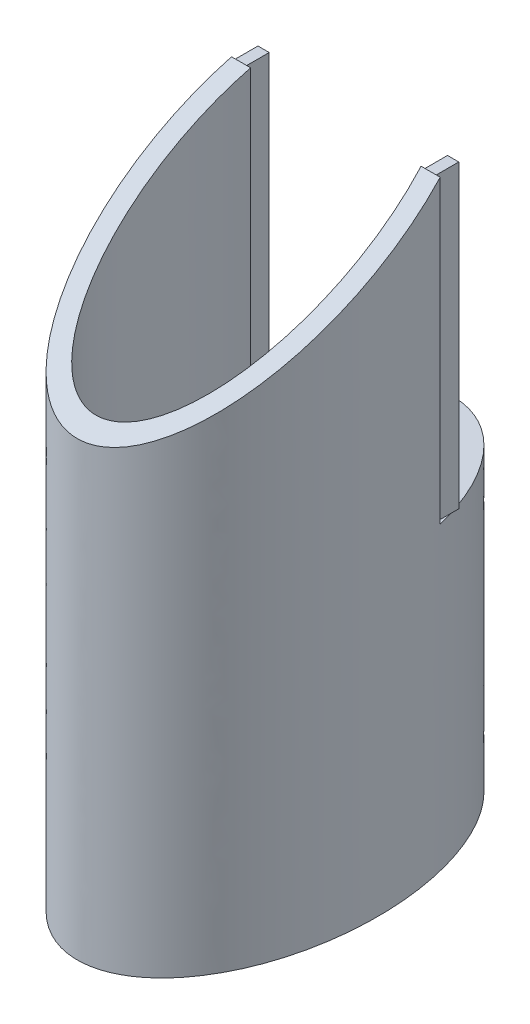
ISO-10303-21;
HEADER;
FILE_DESCRIPTION(('STEP AP214'),'2;1');
FILE_NAME('part.step','',(''),(''),'','','');
FILE_SCHEMA(('AUTOMOTIVE_DESIGN { 1 0 10303 214 1 1 1 1 }'));
ENDSEC;
DATA;
#1=APPLICATION_CONTEXT('core data for automotive mechanical design processes');
#2=APPLICATION_PROTOCOL_DEFINITION('international standard','automotive_design',2000,#1);
#3=PRODUCT_CONTEXT('',#1,'mechanical');
#4=PRODUCT('Part','Part','',(#3));
#5=PRODUCT_RELATED_PRODUCT_CATEGORY('part','',(#4));
#6=PRODUCT_DEFINITION_FORMATION('','',#4);
#7=PRODUCT_DEFINITION_CONTEXT('part definition',#1,'design');
#8=PRODUCT_DEFINITION('design','',#6,#7);
#9=PRODUCT_DEFINITION_SHAPE('','',#8);
#10=(LENGTH_UNIT() NAMED_UNIT(*) SI_UNIT(.MILLI.,.METRE.));
#11=(NAMED_UNIT(*) PLANE_ANGLE_UNIT() SI_UNIT($,.RADIAN.));
#12=(NAMED_UNIT(*) SI_UNIT($,.STERADIAN.) SOLID_ANGLE_UNIT());
#13=UNCERTAINTY_MEASURE_WITH_UNIT(LENGTH_MEASURE(1.E-05),#10,'distance_accuracy_value','');
#14=(GEOMETRIC_REPRESENTATION_CONTEXT(3) GLOBAL_UNCERTAINTY_ASSIGNED_CONTEXT((#13)) GLOBAL_UNIT_ASSIGNED_CONTEXT((#10,
#11,#12)) REPRESENTATION_CONTEXT('',''));
#15=CARTESIAN_POINT('',(0.,0.,0.));
#16=DIRECTION('',(0.,0.,1.));
#17=DIRECTION('',(1.,0.,0.));
#18=AXIS2_PLACEMENT_3D('',#15,#16,#17);
#19=CARTESIAN_POINT('',(-15.,40.,-25.));
#20=DIRECTION('',(0.,-1.,0.));
#21=DIRECTION('',(0.,0.,-1.));
#22=AXIS2_PLACEMENT_3D('',#19,#20,#21);
#23=PLANE('',#22);
#24=DIRECTION('',(1.,0.,0.));
#25=VECTOR('',#24,1.);
#26=CARTESIAN_POINT('',(-15.,40.,-9.43240385873634));
#27=LINE('',#26,#25);
#28=CARTESIAN_POINT('',(-13.891389875763,40.,-9.43240385873634));
#29=VERTEX_POINT('',#28);
#30=CARTESIAN_POINT('',(-13.3699801041899,40.,-9.43240385873634));
#31=VERTEX_POINT('',#30);
#32=EDGE_CURVE('E217',#29,#31,#27,.T.);
#33=ORIENTED_EDGE('',*,*,#32,.T.);
#34=DIRECTION('',(0.,0.,1.));
#35=VECTOR('',#34,1.);
#36=CARTESIAN_POINT('',(-13.3699801041899,40.,-12.4324038587363));
#37=LINE('',#36,#35);
#38=CARTESIAN_POINT('',(-13.3699801041899,40.,-11.3337784242951));
#39=VERTEX_POINT('',#38);
#40=EDGE_CURVE('E166',#39,#31,#37,.T.);
#41=ORIENTED_EDGE('',*,*,#40,.F.);
#42=CARTESIAN_POINT('',(0.,40.,0.));
#43=DIRECTION('',(0.,1.,0.));
#44=DIRECTION('',(0.,0.,-1.));
#45=AXIS2_PLACEMENT_3D('',#42,#43,#44);
#46=ELLIPSE('',#45,25.,15.);
#47=EDGE_CURVE('E230',#29,#39,#46,.F.);
#48=ORIENTED_EDGE('',*,*,#47,.F.);
#49=EDGE_LOOP('',(#33,#41,#48));
#50=FACE_BOUND('',#49,.T.);
#51=ADVANCED_FACE('F33',(#50),#23,.F.);
#52=CARTESIAN_POINT('',(-15.,80.,-9.43240385873634));
#53=DIRECTION('',(0.,0.,1.));
#54=DIRECTION('',(0.,-1.,0.));
#55=AXIS2_PLACEMENT_3D('',#52,#53,#54);
#56=PLANE('',#55);
#57=DIRECTION('',(1.,0.,0.));
#58=VECTOR('',#57,1.);
#59=CARTESIAN_POINT('',(-15.,80.,-9.43240385873634));
#60=LINE('',#59,#58);
#61=CARTESIAN_POINT('',(-13.891389875763,80.,-9.43240385873634));
#62=VERTEX_POINT('',#61);
#63=CARTESIAN_POINT('',(-13.3699801041899,80.,-9.43240385873634));
#64=VERTEX_POINT('',#63);
#65=EDGE_CURVE('E239',#62,#64,#60,.T.);
#66=ORIENTED_EDGE('',*,*,#65,.T.);
#67=DIRECTION('',(0.,-1.,0.));
#68=VECTOR('',#67,1.);
#69=CARTESIAN_POINT('',(-13.3699801041899,80.,-9.43240385873634));
#70=LINE('',#69,#68);
#71=EDGE_CURVE('E144',#64,#31,#70,.T.);
#72=ORIENTED_EDGE('',*,*,#71,.T.);
#73=ORIENTED_EDGE('',*,*,#32,.F.);
#74=DIRECTION('',(0.,-1.,0.));
#75=VECTOR('',#74,1.);
#76=CARTESIAN_POINT('',(-13.891389875763,80.,-9.43240385873634));
#77=LINE('',#76,#75);
#78=EDGE_CURVE('E223',#62,#29,#77,.T.);
#79=ORIENTED_EDGE('',*,*,#78,.F.);
#80=EDGE_LOOP('',(#66,#72,#73,#79));
#81=FACE_BOUND('',#80,.T.);
#82=ADVANCED_FACE('F285',(#81),#56,.F.);
#83=DIRECTION('',(0.,0.,1.));
#84=VECTOR('',#83,1.);
#85=CARTESIAN_POINT('',(13.3699801041899,40.,-12.4324038587363));
#86=LINE('',#85,#84);
#87=CARTESIAN_POINT('',(13.3699801041899,40.,-11.3337784242951));
#88=VERTEX_POINT('',#87);
#89=CARTESIAN_POINT('',(13.3699801041899,40.,-9.43240385873634));
#90=VERTEX_POINT('',#89);
#91=EDGE_CURVE('E206',#88,#90,#86,.T.);
#92=ORIENTED_EDGE('',*,*,#91,.T.);
#93=CARTESIAN_POINT('',(13.891389875763,40.,-9.43240385873634));
#94=VERTEX_POINT('',#93);
#95=EDGE_CURVE('E213',#90,#94,#27,.T.);
#96=ORIENTED_EDGE('',*,*,#95,.T.);
#97=EDGE_CURVE('E229',#88,#94,#46,.F.);
#98=ORIENTED_EDGE('',*,*,#97,.F.);
#99=EDGE_LOOP('',(#92,#96,#98));
#100=FACE_BOUND('',#99,.T.);
#101=ADVANCED_FACE('F288',(#100),#23,.F.);
#102=DIRECTION('',(1.,0.,0.));
#103=VECTOR('',#102,1.);
#104=CARTESIAN_POINT('',(-13.3699801041899,40.,-12.4324038587363));
#105=LINE('',#104,#103);
#106=CARTESIAN_POINT('',(-13.0137127809699,40.,-12.4324038587363));
#107=VERTEX_POINT('',#106);
#108=CARTESIAN_POINT('',(-11.8699801041899,40.,-12.4324038587363));
#109=VERTEX_POINT('',#108);
#110=EDGE_CURVE('E162',#107,#109,#105,.T.);
#111=ORIENTED_EDGE('',*,*,#110,.T.);
#112=DIRECTION('',(0.,0.,1.));
#113=VECTOR('',#112,1.);
#114=CARTESIAN_POINT('',(-11.8699801041899,40.,-12.4324038587363));
#115=LINE('',#114,#113);
#116=CARTESIAN_POINT('',(-11.8699801041899,40.,-9.43240385873634));
#117=VERTEX_POINT('',#116);
#118=EDGE_CURVE('E173',#109,#117,#115,.T.);
#119=ORIENTED_EDGE('',*,*,#118,.T.);
#120=CARTESIAN_POINT('',(-11.3485703326168,40.,-9.43240385873634));
#121=VERTEX_POINT('',#120);
#122=EDGE_CURVE('E216',#117,#121,#27,.T.);
#123=ORIENTED_EDGE('',*,*,#122,.T.);
#124=CARTESIAN_POINT('',(0.,40.,0.));
#125=DIRECTION('',(0.,1.,0.));
#126=DIRECTION('',(0.,0.,-1.));
#127=AXIS2_PLACEMENT_3D('',#124,#125,#126);
#128=ELLIPSE('',#127,22.5,12.5);
#129=CARTESIAN_POINT('',(11.3485703326168,40.,-9.43240385873634));
#130=VERTEX_POINT('',#129);
#131=EDGE_CURVE('E11',#121,#130,#128,.F.);
#132=ORIENTED_EDGE('',*,*,#131,.T.);
#133=CARTESIAN_POINT('',(11.8699801041899,40.,-9.43240385873634));
#134=VERTEX_POINT('',#133);
#135=EDGE_CURVE('E214',#130,#134,#27,.T.);
#136=ORIENTED_EDGE('',*,*,#135,.T.);
#137=DIRECTION('',(0.,0.,1.));
#138=VECTOR('',#137,1.);
#139=CARTESIAN_POINT('',(11.8699801041899,40.,-12.4324038587363));
#140=LINE('',#139,#138);
#141=CARTESIAN_POINT('',(11.8699801041899,40.,-12.4324038587363));
#142=VERTEX_POINT('',#141);
#143=EDGE_CURVE('E58',#142,#134,#140,.T.);
#144=ORIENTED_EDGE('',*,*,#143,.F.);
#145=DIRECTION('',(-1.,0.,0.));
#146=VECTOR('',#145,1.);
#147=CARTESIAN_POINT('',(13.3699801041899,40.,-12.4324038587363));
#148=LINE('',#147,#146);
#149=CARTESIAN_POINT('',(13.0137127809699,40.,-12.4324038587363));
#150=VERTEX_POINT('',#149);
#151=EDGE_CURVE('E183',#150,#142,#148,.T.);
#152=ORIENTED_EDGE('',*,*,#151,.F.);
#153=EDGE_CURVE('E234',#107,#150,#46,.F.);
#154=ORIENTED_EDGE('',*,*,#153,.F.);
#155=EDGE_LOOP('',(#111,#119,#123,#132,#136,#144,#152,#154));
#156=FACE_BOUND('',#155,.T.);
#157=ADVANCED_FACE('F287',(#156),#23,.F.);
#158=DIRECTION('',(0.,-1.,0.));
#159=VECTOR('',#158,1.);
#160=CARTESIAN_POINT('',(13.3699801041899,80.,-9.43240385873634));
#161=LINE('',#160,#159);
#162=CARTESIAN_POINT('',(13.3699801041899,80.,-9.43240385873634));
#163=VERTEX_POINT('',#162);
#164=EDGE_CURVE('E179',#163,#90,#161,.T.);
#165=ORIENTED_EDGE('',*,*,#164,.F.);
#166=CARTESIAN_POINT('',(13.891389875763,80.,-9.43240385873634));
#167=VERTEX_POINT('',#166);
#168=EDGE_CURVE('E233',#163,#167,#60,.T.);
#169=ORIENTED_EDGE('',*,*,#168,.T.);
#170=DIRECTION('',(0.,-1.,0.));
#171=VECTOR('',#170,1.);
#172=CARTESIAN_POINT('',(13.891389875763,80.,-9.43240385873634));
#173=LINE('',#172,#171);
#174=EDGE_CURVE('E226',#94,#167,#173,.F.);
#175=ORIENTED_EDGE('',*,*,#174,.F.);
#176=ORIENTED_EDGE('',*,*,#95,.F.);
#177=EDGE_LOOP('',(#165,#169,#175,#176));
#178=FACE_BOUND('',#177,.T.);
#179=ADVANCED_FACE('F259',(#178),#56,.F.);
#180=DIRECTION('',(0.,1.,0.));
#181=VECTOR('',#180,1.);
#182=CARTESIAN_POINT('',(11.8699801041899,80.,-9.43240385873634));
#183=LINE('',#182,#181);
#184=CARTESIAN_POINT('',(11.8699801041899,80.,-9.43240385873634));
#185=VERTEX_POINT('',#184);
#186=EDGE_CURVE('E195',#134,#185,#183,.T.);
#187=ORIENTED_EDGE('',*,*,#186,.F.);
#188=ORIENTED_EDGE('',*,*,#135,.F.);
#189=DIRECTION('',(0.,-1.,0.));
#190=VECTOR('',#189,1.);
#191=CARTESIAN_POINT('',(11.3485703326168,80.,-9.43240385873634));
#192=LINE('',#191,#190);
#193=CARTESIAN_POINT('',(11.3485703326168,80.,-9.43240385873634));
#194=VERTEX_POINT('',#193);
#195=EDGE_CURVE('E221',#130,#194,#192,.F.);
#196=ORIENTED_EDGE('',*,*,#195,.T.);
#197=EDGE_CURVE('E235',#194,#185,#60,.T.);
#198=ORIENTED_EDGE('',*,*,#197,.T.);
#199=EDGE_LOOP('',(#187,#188,#196,#198));
#200=FACE_BOUND('',#199,.T.);
#201=ADVANCED_FACE('F293',(#200),#56,.F.);
#202=CARTESIAN_POINT('',(0.,80.,0.));
#203=DIRECTION('',(0.,1.,0.));
#204=DIRECTION('',(0.,0.,-1.));
#205=AXIS2_PLACEMENT_3D('',#202,#203,#204);
#206=ELLIPSE('',#205,25.,15.);
#207=DIRECTION('',(0.,-1.,0.));
#208=VECTOR('',#207,1.);
#209=SURFACE_OF_LINEAR_EXTRUSION('',#206,#208);
#210=CARTESIAN_POINT('',(0.,0.,0.));
#211=DIRECTION('',(0.,1.,0.));
#212=DIRECTION('',(0.,0.,-1.));
#213=AXIS2_PLACEMENT_3D('',#210,#211,#212);
#214=ELLIPSE('',#213,25.,15.);
#215=CARTESIAN_POINT('',(0.,0.,-25.));
#216=VERTEX_POINT('',#215);
#217=EDGE_CURVE('E269',#216,#216,#214,.T.);
#218=ORIENTED_EDGE('',*,*,#217,.T.);
#219=EDGE_LOOP('',(#218));
#220=FACE_BOUND('',#219,.T.);
#221=ORIENTED_EDGE('',*,*,#47,.T.);
#222=CARTESIAN_POINT('',(0.,40.,0.));
#223=DIRECTION('',(0.,1.,0.));
#224=DIRECTION('',(0.,0.,-1.));
#225=AXIS2_PLACEMENT_3D('',#222,#223,#224);
#226=ELLIPSE('',#225,25.,15.);
#227=EDGE_CURVE('E146',#39,#107,#226,.F.);
#228=ORIENTED_EDGE('',*,*,#227,.T.);
#229=ORIENTED_EDGE('',*,*,#153,.T.);
#230=CARTESIAN_POINT('',(0.,40.,0.));
#231=DIRECTION('',(0.,1.,0.));
#232=DIRECTION('',(0.,0.,-1.));
#233=AXIS2_PLACEMENT_3D('',#230,#231,#232);
#234=ELLIPSE('',#233,25.,15.);
#235=EDGE_CURVE('E210',#88,#150,#234,.T.);
#236=ORIENTED_EDGE('',*,*,#235,.F.);
#237=ORIENTED_EDGE('',*,*,#97,.T.);
#238=ORIENTED_EDGE('',*,*,#174,.T.);
#239=CARTESIAN_POINT('',(13.891389875763,80.,-9.43240385873634));
#240=CARTESIAN_POINT('',(13.9691722572692,79.8163180522933,-9.11417694323094));
#241=CARTESIAN_POINT('',(14.0425702852247,79.6321815787162,-8.79516256674996));
#242=CARTESIAN_POINT('',(14.1808212896144,79.2631160717446,-8.15576071278812));
#243=CARTESIAN_POINT('',(14.2456746189232,79.0781870714053,-7.83537329257508));
#244=CARTESIAN_POINT('',(14.4277350836751,78.5224456343772,-6.87255748224663));
#245=CARTESIAN_POINT('',(14.5324771091048,78.1505969201434,-6.22833375289996));
#246=CARTESIAN_POINT('',(14.7100068827078,77.4050788497254,-4.93673205243561));
#247=CARTESIAN_POINT('',(14.7827994444004,77.0314097763805,-4.28935457133352));
#248=CARTESIAN_POINT('',(14.897342305784,76.2828640780965,-2.99250753952791));
#249=CARTESIAN_POINT('',(14.939090799703,75.9079873841861,-2.34303786933244));
#250=CARTESIAN_POINT('',(14.9920291863666,75.1577338025655,-1.0432319487899));
#251=CARTESIAN_POINT('',(15.0032219417139,74.7823569650078,-0.392895785331507));
#252=CARTESIAN_POINT('',(14.9951882731402,74.0316845895147,0.907635690900739));
#253=CARTESIAN_POINT('',(14.9759618966811,73.6563890514535,1.55783100389278));
#254=CARTESIAN_POINT('',(14.906863295051,72.9064858991288,2.85702980960819));
#255=CARTESIAN_POINT('',(14.8569898737968,72.5318783122868,3.50603325482415));
#256=CARTESIAN_POINT('',(14.7260016180444,71.7840159133354,4.80169647819505));
#257=CARTESIAN_POINT('',(14.6448860840158,71.4107611317051,5.44835620354538));
#258=CARTESIAN_POINT('',(14.4504025411897,70.6662705541821,6.7381777840864));
#259=CARTESIAN_POINT('',(14.3370280456588,70.2950351796744,7.38133890923238));
#260=CARTESIAN_POINT('',(14.0765971174623,69.5555340309266,8.66251636034721));
#261=CARTESIAN_POINT('',(13.9295424358526,69.1872681033329,9.30053295199929));
#262=CARTESIAN_POINT('',(13.5997172310253,68.4546007464991,10.5698709352232));
#263=CARTESIAN_POINT('',(13.4169348353862,68.0902006444374,11.2011900274732));
#264=CARTESIAN_POINT('',(13.0130237880806,67.3666394847937,12.4547516261371));
#265=CARTESIAN_POINT('',(12.7918865635688,67.0074796179765,13.076992069564));
#266=CARTESIAN_POINT('',(12.3075540063087,66.2957515890738,14.3100529018569));
#267=CARTESIAN_POINT('',(12.0443092062778,65.9431917315604,14.9208589031446));
#268=CARTESIAN_POINT('',(11.614830693757,65.4216374728512,15.8244458102408));
#269=CARTESIAN_POINT('',(11.4659481580687,65.2490465907758,16.12345757886));
#270=CARTESIAN_POINT('',(11.1559285715647,64.9066403431425,16.7166725648427));
#271=CARTESIAN_POINT('',(10.9947920731019,64.7368248529012,17.0108759982187));
#272=CARTESIAN_POINT('',(10.5818311684968,64.3224880173983,17.7287099214133));
#273=CARTESIAN_POINT('',(10.3225743020213,64.0797998934683,18.1491643758235));
#274=CARTESIAN_POINT('',(9.77298435631481,63.6027950517577,18.9755699173254));
#275=CARTESIAN_POINT('',(9.48260212264972,63.3684923786046,19.3814966722574));
#276=CARTESIAN_POINT('',(8.92940222405932,62.9570124976655,20.0943809536938));
#277=CARTESIAN_POINT('',(8.67269622367722,62.7777861422272,20.4048886055371));
#278=CARTESIAN_POINT('',(8.1355944711672,62.4282831862683,21.0103985591466));
#279=CARTESIAN_POINT('',(7.85519170594174,62.25800925959,21.305396228511));
#280=CARTESIAN_POINT('',(7.26934033201011,61.929013394506,21.8753778770445));
#281=CARTESIAN_POINT('',(6.96393244622412,61.7702734377836,22.1503930727451));
#282=CARTESIAN_POINT('',(6.32603523068147,61.4670558585028,22.6757141300739));
#283=CARTESIAN_POINT('',(5.99356446551816,61.3225686068766,22.9260366739543));
#284=CARTESIAN_POINT('',(5.43673907562542,61.1048929307523,23.3031573429064));
#285=CARTESIAN_POINT('',(5.22126293758054,61.026005042815,23.4398297245011));
#286=CARTESIAN_POINT('',(4.77982350476954,60.8758439566422,23.6999821231354));
#287=CARTESIAN_POINT('',(4.55385849471765,60.8045720102086,23.8234599714422));
#288=CARTESIAN_POINT('',(4.09183826666161,60.6708083476521,24.0552040174603));
#289=CARTESIAN_POINT('',(3.85578730496099,60.6083129745966,24.1634765507664));
#290=CARTESIAN_POINT('',(3.37425618582548,60.4932849981814,24.3627612305537));
#291=CARTESIAN_POINT('',(3.12878084331744,60.4407473867453,24.4537820534711));
#292=CARTESIAN_POINT('',(2.62625774946812,60.3462016255477,24.6175815249796));
#293=CARTESIAN_POINT('',(2.36910324262639,60.3043343005629,24.6901161962236));
#294=CARTESIAN_POINT('',(1.84789191895349,60.2331479588341,24.8134457353388));
#295=CARTESIAN_POINT('',(1.58383523677758,60.2038286974822,24.8642410269905));
#296=CARTESIAN_POINT('',(1.05141843206874,60.15866829689,24.9424809148122));
#297=CARTESIAN_POINT('',(0.783063372528554,60.1428123405568,24.9699511814297));
#298=CARTESIAN_POINT('',(0.244522295375012,60.1250589349879,25.0007087575793));
#299=CARTESIAN_POINT('',(-0.0256634395069784,60.1231593773726,25.0039997198556));
#300=CARTESIAN_POINT('',(-0.524337138653941,60.1326011338996,24.9876419825055));
#301=CARTESIAN_POINT('',(-0.752982398672291,60.1419932197958,24.9713702989665));
#302=CARTESIAN_POINT('',(-1.20774890172815,60.1706488979265,24.9217246578075));
#303=CARTESIAN_POINT('',(-1.43387049206654,60.1899111143078,24.8883530838377));
#304=CARTESIAN_POINT('',(-1.88215691709891,60.2378712363048,24.8052627100642));
#305=CARTESIAN_POINT('',(-2.10431994356141,60.266573343098,24.7555366317678));
#306=CARTESIAN_POINT('',(-2.54332095944435,60.3327977460061,24.640803596041));
#307=CARTESIAN_POINT('',(-2.7601581183926,60.3703214081589,24.5757942719651));
#308=CARTESIAN_POINT('',(-3.24633323336243,60.4649261367014,24.4118926401925));
#309=CARTESIAN_POINT('',(-3.51369820683925,60.524547560558,24.3085991916592));
#310=CARTESIAN_POINT('',(-4.0367798565143,60.6554037393262,24.0818923287142));
#311=CARTESIAN_POINT('',(-4.29249343938487,60.7266415555527,23.9584736106086));
#312=CARTESIAN_POINT('',(-4.79196631408531,60.8793031834411,23.6939890514809));
#313=CARTESIAN_POINT('',(-5.03570527426264,60.9607435387534,23.5528945487696));
#314=CARTESIAN_POINT('',(-5.51058211201528,61.1322890441762,23.2556938834834));
#315=CARTESIAN_POINT('',(-5.74171948971172,61.2223945376235,23.0995871260812));
#316=CARTESIAN_POINT('',(-6.31472489097134,61.4613814809127,22.6855449256446));
#317=CARTESIAN_POINT('',(-6.64796941198343,61.615443263282,22.4186346145729));
#318=CARTESIAN_POINT('',(-7.28631805076753,61.9375177114868,21.8606442432003));
#319=CARTESIAN_POINT('',(-7.59140498157578,62.105538780526,21.5695496244433));
#320=CARTESIAN_POINT('',(-8.17572907478409,62.4527943071829,20.967933316908));
#321=CARTESIAN_POINT('',(-8.45492991565614,62.6320439466171,20.6573853258028));
#322=CARTESIAN_POINT('',(-8.98902432228292,62.9992640718325,20.0211805750487));
#323=CARTESIAN_POINT('',(-9.24392310027856,63.1872326746795,19.6955270775621));
#324=CARTESIAN_POINT('',(-9.70440327487929,63.548985257037,19.0687947835233));
#325=CARTESIAN_POINT('',(-9.91231926545113,63.7220314670505,18.7689941643551));
#326=CARTESIAN_POINT('',(-10.3117731887537,64.0727669679304,18.1613488404856));
#327=CARTESIAN_POINT('',(-10.5033115210897,64.2504561453728,17.85350433229));
#328=CARTESIAN_POINT('',(-10.87087130989,64.6094889131023,17.2314840866079));
#329=CARTESIAN_POINT('',(-11.0469131209659,64.7908273133082,16.9173173408787));
#330=CARTESIAN_POINT('',(-11.3847353976437,65.1567851534985,16.2832994847817));
#331=CARTESIAN_POINT('',(-11.5465158401583,65.3414045987937,15.9634483652127));
#332=CARTESIAN_POINT('',(-11.8563587327144,65.7130627760524,15.3195547390398));
#333=CARTESIAN_POINT('',(-12.0044477719246,65.9000959791563,14.9955218111232));
#334=CARTESIAN_POINT('',(-12.2880082444287,66.2765433724061,14.3433309219281));
#335=CARTESIAN_POINT('',(-12.4234786541959,66.4659577542832,14.0151726284776));
#336=CARTESIAN_POINT('',(-12.81198408179,67.0373092640561,13.0253125420924));
#337=CARTESIAN_POINT('',(-13.0470860027999,67.4223215999485,12.3582829857739));
#338=CARTESIAN_POINT('',(-13.4733640583201,68.1978761152158,11.0146434812874));
#339=CARTESIAN_POINT('',(-13.6645844955263,68.5884122909269,10.3380439343997));
#340=CARTESIAN_POINT('',(-14.0065234937142,69.3738362952411,8.97730565076679));
#341=CARTESIAN_POINT('',(-14.1572456822324,69.7687237307895,8.29316759498449));
#342=CARTESIAN_POINT('',(-14.4204535100895,70.5615042994578,6.91968414606824));
#343=CARTESIAN_POINT('',(-14.5329528029914,70.9593963072905,6.23034070248155));
#344=CARTESIAN_POINT('',(-14.7214123472149,71.7573289852471,4.84793128197337));
#345=CARTESIAN_POINT('',(-14.7973723275524,72.1573696712838,4.15486527748304));
#346=CARTESIAN_POINT('',(-14.9137949441453,72.9586668560043,2.76662688671917));
#347=CARTESIAN_POINT('',(-14.9542634126202,73.3599231440532,2.07145486536844));
#348=CARTESIAN_POINT('',(-15.0002712042096,74.1629386478452,0.680239506074035));
#349=CARTESIAN_POINT('',(-15.0058100548669,74.5646978703174,-0.0158038435278424));
#350=CARTESIAN_POINT('',(-14.981470349293,75.3869899754858,-1.44041569863495));
#351=CARTESIAN_POINT('',(-14.9499012452888,75.8075104393267,-2.16896268861257));
#352=CARTESIAN_POINT('',(-14.8480661224218,76.6473795733095,-3.62402654911915));
#353=CARTESIAN_POINT('',(-14.7778022761963,77.0667283079133,-4.35054353132754));
#354=CARTESIAN_POINT('',(-14.6421773430681,77.6960234397999,-5.4407902935328));
#355=CARTESIAN_POINT('',(-14.5916319421316,77.9067898158691,-5.80594067758602));
#356=CARTESIAN_POINT('',(-14.4802085141043,78.3276396779509,-6.53505834632386));
#357=CARTESIAN_POINT('',(-14.4193306983084,78.5377231778386,-6.89902565504697));
#358=CARTESIAN_POINT('',(-14.2869890855478,78.9570991899227,-7.62558989518421));
#359=CARTESIAN_POINT('',(-14.2155231788966,79.1663915359386,-7.98818653869249));
#360=CARTESIAN_POINT('',(-14.0617012227855,79.5839847535098,-8.7116621073195));
#361=CARTESIAN_POINT('',(-13.9793445778921,79.7922855702092,-9.07254093740111));
#362=CARTESIAN_POINT('',(-13.891389875763,80.,-9.43240385873632));
#363=B_SPLINE_CURVE_WITH_KNOTS('',3,(#239,#240,#241,#242,#243,#244,#245,#246,#247,#248,#249,
#250,#251,#252,#253,#254,#255,#256,#257,#258,#259,#260,#261,#262,#263,#264,#265,#266,#267,#268,
#269,#270,#271,#272,#273,#274,#275,#276,#277,#278,#279,#280,#281,#282,#283,#284,#285,#286,#287,
#288,#289,#290,#291,#292,#293,#294,#295,#296,#297,#298,#299,#300,#301,#302,#303,#304,#305,#306,
#307,#308,#309,#310,#311,#312,#313,#314,#315,#316,#317,#318,#319,#320,#321,#322,#323,#324,#325,
#326,#327,#328,#329,#330,#331,#332,#333,#334,#335,#336,#337,#338,#339,#340,#341,#342,#343,#344,
#345,#346,#347,#348,#349,#350,#351,#352,#353,#354,#355,#356,#357,#358,#359,#360,#361,#362),
.UNSPECIFIED.,.F.,.F.,(4,2,2,2,2,2,2,2,2,2,2,2,2,2,2,2,2,2,2,2,2,2,2,2,2,2,2,2,2,2,2,2,2,2,2,2,
2,2,2,2,2,2,2,2,2,2,2,2,2,2,2,2,2,2,2,2,2,2,2,2,2,4),(0.,1.12666871968438,2.25329089619278,
4.5060338442698,6.75843727658321,9.01097171649737,11.2632951213344,13.5156150119601,
15.7680228110015,18.020481045786,20.2733925324321,22.5261869152543,24.7797311846935,
27.0337798037118,29.2904961572355,30.4182366344189,31.5459263082848,33.195993778566,
34.8487066045398,36.1707036293423,37.4930932808044,38.8133705883389,40.1327497236204,
40.9334548502215,41.7342913837468,42.5347932365432,43.334891416847,44.1450581899113,
44.9552091691255,45.7644673735701,46.5736033216448,47.2609960830119,47.9482930508758,
48.635896311757,49.3236061197817,50.2005636974434,51.0777527579054,51.9563830719822,
52.8350482141961,54.1945581260053,55.5548924485419,56.9171074897769,58.2790297064343,
59.4899615942072,60.7008639275078,61.910151243705,63.1194405175412,64.3263296846546,
65.5333166603069,67.9475053754584,70.3592458988179,72.7707703240566,75.1814324231312,
77.5921123999619,80.0023961623132,82.4127125260394,84.9372321647561,87.4616100708632,
88.7354003069261,90.0091644974678,91.2831828288322,92.5572708439221),.UNSPECIFIED.);
#364=EDGE_CURVE('E240',#167,#62,#363,.T.);
#365=ORIENTED_EDGE('',*,*,#364,.T.);
#366=ORIENTED_EDGE('',*,*,#78,.T.);
#367=EDGE_LOOP('',(#221,#228,#229,#236,#237,#238,#365,#366));
#368=FACE_BOUND('',#367,.T.);
#369=ADVANCED_FACE('F35',(#220,#368),#209,.F.);
#370=CARTESIAN_POINT('',(0.,0.,0.));
#371=DIRECTION('',(0.,1.,0.));
#372=DIRECTION('',(0.,0.,1.));
#373=AXIS2_PLACEMENT_3D('',#370,#371,#372);
#374=PLANE('',#373);
#375=ORIENTED_EDGE('',*,*,#217,.F.);
#376=EDGE_LOOP('',(#375));
#377=FACE_BOUND('',#376,.T.);
#378=CARTESIAN_POINT('',(0.,0.,0.));
#379=DIRECTION('',(0.,1.,0.));
#380=DIRECTION('',(0.,0.,-1.));
#381=AXIS2_PLACEMENT_3D('',#378,#379,#380);
#382=ELLIPSE('',#381,22.5,12.5);
#383=CARTESIAN_POINT('',(0.,0.,-22.5));
#384=VERTEX_POINT('',#383);
#385=EDGE_CURVE('E248',#384,#384,#382,.T.);
#386=ORIENTED_EDGE('',*,*,#385,.T.);
#387=EDGE_LOOP('',(#386));
#388=FACE_BOUND('',#387,.T.);
#389=ADVANCED_FACE('F275',(#377,#388),#374,.F.);
#390=CARTESIAN_POINT('',(0.,80.,0.));
#391=DIRECTION('',(0.,1.,0.));
#392=DIRECTION('',(0.,0.,-1.));
#393=AXIS2_PLACEMENT_3D('',#390,#391,#392);
#394=ELLIPSE('',#393,22.5,12.5);
#395=DIRECTION('',(0.,-1.,0.));
#396=VECTOR('',#395,1.);
#397=SURFACE_OF_LINEAR_EXTRUSION('',#394,#396);
#398=ORIENTED_EDGE('',*,*,#195,.F.);
#399=ORIENTED_EDGE('',*,*,#131,.F.);
#400=DIRECTION('',(0.,-1.,0.));
#401=VECTOR('',#400,1.);
#402=CARTESIAN_POINT('',(-11.3485703326168,80.,-9.43240385873634));
#403=LINE('',#402,#401);
#404=CARTESIAN_POINT('',(-11.3485703326168,80.,-9.43240385873634));
#405=VERTEX_POINT('',#404);
#406=EDGE_CURVE('E218',#405,#121,#403,.T.);
#407=ORIENTED_EDGE('',*,*,#406,.F.);
#408=CARTESIAN_POINT('',(11.3485703326168,80.,-9.43240385873634));
#409=CARTESIAN_POINT('',(11.4113901300837,79.8586437716124,-9.18750577752109));
#410=CARTESIAN_POINT('',(11.4713863210278,79.7169791152726,-8.94207334833582));
#411=CARTESIAN_POINT('',(11.5858885263564,79.4331001550147,-8.45025623169692));
#412=CARTESIAN_POINT('',(11.6403946913338,79.2908858662844,-8.20387157055588));
#413=CARTESIAN_POINT('',(11.7959033000072,78.8635497970695,-7.46351662066399));
#414=CARTESIAN_POINT('',(11.8889143283816,78.5776930015104,-6.96827292653543));
#415=CARTESIAN_POINT('',(12.0545850543227,78.0045570725742,-5.97532135395148));
#416=CARTESIAN_POINT('',(12.1272471161277,77.7172781083815,-5.47761376860624));
#417=CARTESIAN_POINT('',(12.2529660905023,77.141647902237,-4.48034088871737));
#418=CARTESIAN_POINT('',(12.3060227318542,76.8532966455071,-3.98077556857075));
#419=CARTESIAN_POINT('',(12.3930370877031,76.2759134209941,-2.98046560400814));
#420=CARTESIAN_POINT('',(12.4269971340865,75.9868815406522,-2.479721111083));
#421=CARTESIAN_POINT('',(12.4761507984428,75.4083983857461,-1.47750552944341));
#422=CARTESIAN_POINT('',(12.4913429820821,75.1189470808196,-0.976034388126713));
#423=CARTESIAN_POINT('',(12.5031085089951,74.5394111710959,0.0280050794340637));
#424=CARTESIAN_POINT('',(12.4996471300132,74.2493263906657,0.530573709960223));
#425=CARTESIAN_POINT('',(12.4739921888047,73.6693458851711,1.53538343471057));
#426=CARTESIAN_POINT('',(12.4517975084633,73.3794501724249,2.03762450759345));
#427=CARTESIAN_POINT('',(12.3884538978618,72.8000610205699,3.04140971879176));
#428=CARTESIAN_POINT('',(12.3472975491662,72.5105677834255,3.54295350720581));
#429=CARTESIAN_POINT('',(12.2456359721161,71.9324356005742,4.54456103369455));
#430=CARTESIAN_POINT('',(12.1851312129756,71.6437966343218,5.04462480736398));
#431=CARTESIAN_POINT('',(12.0441124621382,71.0674695362427,6.04310504471806));
#432=CARTESIAN_POINT('',(11.9635801764265,70.7797825187787,6.54151957778188));
#433=CARTESIAN_POINT('',(11.7817038582178,70.2060376684094,7.5355260999232));
#434=CARTESIAN_POINT('',(11.6803589111632,69.9199799076654,8.03111796398205));
#435=CARTESIAN_POINT('',(11.4558077769471,69.3501235693316,9.01838768260839));
#436=CARTESIAN_POINT('',(11.3326101625928,69.0663241512463,9.51006699332483));
#437=CARTESIAN_POINT('',(11.0629274059236,68.5015311033232,10.4885646180692));
#438=CARTESIAN_POINT('',(10.9164453621311,68.2205371054409,10.9753835697302));
#439=CARTESIAN_POINT('',(10.5986275816841,67.6625662663573,11.9420617941303));
#440=CARTESIAN_POINT('',(10.4273334507002,67.3855835376917,12.4219312668356));
#441=CARTESIAN_POINT('',(10.0575148823597,66.8363593657769,13.3734559884076));
#442=CARTESIAN_POINT('',(9.85900646017119,66.564115239348,13.8451158858531));
#443=CARTESIAN_POINT('',(9.43163458374194,66.0254506462286,14.7783462555247));
#444=CARTESIAN_POINT('',(9.20275929512139,65.7590324973926,15.2399127120938));
#445=CARTESIAN_POINT('',(8.83369869458676,65.3651512492996,15.9223075593882));
#446=CARTESIAN_POINT('',(8.70624862030994,65.2346892014745,16.148331594892));
#447=CARTESIAN_POINT('',(8.44221973832143,64.9760986789164,16.596336776675));
#448=CARTESIAN_POINT('',(8.3056414524821,64.8479700713093,16.8183181531568));
#449=CARTESIAN_POINT('',(7.96034801794303,64.5385379006619,17.3544059203689));
#450=CARTESIAN_POINT('',(7.74637016938992,64.3586876229115,17.6659945106241));
#451=CARTESIAN_POINT('',(7.2958321662116,64.0060663525149,18.2769069090436));
#452=CARTESIAN_POINT('',(7.05926437948462,63.8332977808291,18.5762265229212));
#453=CARTESIAN_POINT('',(6.56156608485712,63.4973380948325,19.1582729131281));
#454=CARTESIAN_POINT('',(6.30048805274465,63.3341276814536,19.4410331248765));
#455=CARTESIAN_POINT('',(5.75066256791664,63.0198404850041,19.9855321698703));
#456=CARTESIAN_POINT('',(5.46193887274274,62.8687534852215,20.2472887034545));
#457=CARTESIAN_POINT('',(4.99587936613981,62.6494024575365,20.6273119002067));
#458=CARTESIAN_POINT('',(4.82936644797109,62.5753639818408,20.7555827294502));
#459=CARTESIAN_POINT('',(4.48730159381645,62.4326380841394,21.0028537473992));
#460=CARTESIAN_POINT('',(4.31174827648585,62.3639514839369,21.1218525123398));
#461=CARTESIAN_POINT('',(3.95158898573746,62.2329048466467,21.3488893425392));
#462=CARTESIAN_POINT('',(3.76698956359556,62.1705403286256,21.4569351709651));
#463=CARTESIAN_POINT('',(3.38875099064693,62.0531502230781,21.6603122129969));
#464=CARTESIAN_POINT('',(3.19511682459332,61.9981206517853,21.7556503284335));
#465=CARTESIAN_POINT('',(2.83010332154889,61.9044583825822,21.9179191599646));
#466=CARTESIAN_POINT('',(2.65997637115754,61.8646072170199,21.9869608576083));
#467=CARTESIAN_POINT('',(2.31409135441311,61.7916508725575,22.1133569066197));
#468=CARTESIAN_POINT('',(2.13833605560476,61.7585424353528,22.1707169029632));
#469=CARTESIAN_POINT('',(1.78200444891279,61.6997623656003,22.272552714942));
#470=CARTESIAN_POINT('',(1.6014310025833,61.6740864216492,22.3170360000347));
#471=CARTESIAN_POINT('',(1.23644915208861,61.6307616649723,22.392095655349));
#472=CARTESIAN_POINT('',(1.05204078351081,61.6131127777915,22.4226721545628));
#473=CARTESIAN_POINT('',(0.679573957642143,61.5862264100262,22.4692524853461));
#474=CARTESIAN_POINT('',(0.491499761792852,61.5770430291149,22.485162589838));
#475=CARTESIAN_POINT('',(0.114451134765423,61.5675454064773,22.5016171145985));
#476=CARTESIAN_POINT('',(-0.0745232973108748,61.5672311736015,22.5021615195337));
#477=CARTESIAN_POINT('',(-0.451719136060638,61.575481537598,22.4878678563883));
#478=CARTESIAN_POINT('',(-0.639940417195465,61.5840475574576,22.4730273229983));
#479=CARTESIAN_POINT('',(-1.01398635810289,61.6098137795867,22.4283876319741));
#480=CARTESIAN_POINT('',(-1.19981107164829,61.6270137877848,22.3985888105663));
#481=CARTESIAN_POINT('',(-1.55022790884177,61.6675640813265,22.3283358815347));
#482=CARTESIAN_POINT('',(-1.71516451355631,61.6901778510409,22.2891577789829));
#483=CARTESIAN_POINT('',(-2.04112002655112,61.7416433627742,22.1999943567834));
#484=CARTESIAN_POINT('',(-2.20213775844702,61.7704969528095,22.1500058354681));
#485=CARTESIAN_POINT('',(-2.67818060771758,61.8656302275577,21.9851885033186));
#486=CARTESIAN_POINT('',(-2.98639061240786,61.9405059689928,21.8554671205668));
#487=CARTESIAN_POINT('',(-3.76187113640337,62.1598591216408,21.4754402423403));
#488=CARTESIAN_POINT('',(-4.21246487403265,62.3190297327227,21.199678942789));
#489=CARTESIAN_POINT('',(-4.8469174815678,62.5821947004423,20.7437485860389));
#490=CARTESIAN_POINT('',(-5.05185888370245,62.6741905309274,20.5843668409076));
#491=CARTESIAN_POINT('',(-5.44868268879771,62.8650143620405,20.2537666924543));
#492=CARTESIAN_POINT('',(-5.64056603558639,62.9638418678362,20.0825491464237));
#493=CARTESIAN_POINT('',(-6.04051353117028,63.1827508697809,19.7032917543122));
#494=CARTESIAN_POINT('',(-6.24652480188206,63.3037629667606,19.4936396527231));
#495=CARTESIAN_POINT('',(-6.64345291120009,63.5519213737738,19.0637079941878));
#496=CARTESIAN_POINT('',(-6.83435983568526,63.6790716260264,18.8434216073912));
#497=CARTESIAN_POINT('',(-7.20218583406408,63.9383659287245,18.3941971344045));
#498=CARTESIAN_POINT('',(-7.37910072556489,64.0705114550051,18.1652564913466));
#499=CARTESIAN_POINT('',(-7.72011917007846,64.3390007132773,17.7001018608942));
#500=CARTESIAN_POINT('',(-7.88421253774972,64.4753476653501,17.4638822947452));
#501=CARTESIAN_POINT('',(-8.20036331840111,64.7514044753937,16.9856169656739));
#502=CARTESIAN_POINT('',(-8.35242538327378,64.8911130060951,16.7435735022308));
#503=CARTESIAN_POINT('',(-8.64542605114669,65.173374963781,16.2545578244228));
#504=CARTESIAN_POINT('',(-8.78636637707059,65.3159279458138,16.0075863809318));
#505=CARTESIAN_POINT('',(-9.14759435186827,65.6983998330605,15.3449581234158));
#506=CARTESIAN_POINT('',(-9.3588321653072,65.9404624968442,14.9255872716984));
#507=CARTESIAN_POINT('',(-9.75548992636491,66.4293527674049,14.0785903579378));
#508=CARTESIAN_POINT('',(-9.94094737219231,66.6761728461189,13.6509773381796));
#509=CARTESIAN_POINT('',(-10.2892105574029,67.1745012561018,12.7876289536625));
#510=CARTESIAN_POINT('',(-10.4519542865954,67.426020375083,12.3518748993131));
#511=CARTESIAN_POINT('',(-10.7560886638061,67.9322857751327,11.4747757684711));
#512=CARTESIAN_POINT('',(-10.8974763888522,68.1870324927966,11.0334299355821));
#513=CARTESIAN_POINT('',(-11.1605099233557,68.6993382096148,10.1458660236449));
#514=CARTESIAN_POINT('',(-11.282134642194,68.9568999041578,9.69964327486601));
#515=CARTESIAN_POINT('',(-11.5066561063265,69.4740362951679,8.80371027403858));
#516=CARTESIAN_POINT('',(-11.6095536269534,69.7336109078331,8.35400016717571));
#517=CARTESIAN_POINT('',(-11.7973844463694,70.253815288461,7.4527519087247));
#518=CARTESIAN_POINT('',(-11.8823547290578,70.5144417309431,7.00121951849408));
#519=CARTESIAN_POINT('',(-12.0353448302141,71.0369326167089,6.09600991552102));
#520=CARTESIAN_POINT('',(-12.1033645391373,71.2987970679822,5.64233268893669));
#521=CARTESIAN_POINT('',(-12.2230025028503,71.8233685440867,4.73351848652313));
#522=CARTESIAN_POINT('',(-12.2746262750088,72.0860752553679,4.278382053916));
#523=CARTESIAN_POINT('',(-12.3619215540434,72.6121519668643,3.36696004805838));
#524=CARTESIAN_POINT('',(-12.3975927931641,72.875521978138,2.91067445564909));
#525=CARTESIAN_POINT('',(-12.455491184951,73.4237609285265,1.96085661932809));
#526=CARTESIAN_POINT('',(-12.4764146804068,73.708664392292,1.46726456184584));
#527=CARTESIAN_POINT('',(-12.5001738477111,74.2786595491777,0.479754341634495));
#528=CARTESIAN_POINT('',(-12.5030094340337,74.5637512431814,-0.0141638226255059));
#529=CARTESIAN_POINT('',(-12.490617790399,75.1338405694796,-1.00183719028844));
#530=CARTESIAN_POINT('',(-12.4753903455033,75.4188382006143,-1.49559239168228));
#531=CARTESIAN_POINT('',(-12.4267350974903,75.9884435803736,-2.4824273273913));
#532=CARTESIAN_POINT('',(-12.3933074367385,76.2730513320304,-2.97550706695982));
#533=CARTESIAN_POINT('',(-12.3071885518133,76.8466208182305,-3.96920977264374));
#534=CARTESIAN_POINT('',(-12.2541660001207,77.1355701886599,-4.46981131807034));
#535=CARTESIAN_POINT('',(-12.1284405925456,77.7123862262041,-5.4691386375672));
#536=CARTESIAN_POINT('',(-12.0557385660573,78.0002529384295,-5.96786448979092));
#537=CARTESIAN_POINT('',(-11.8898989412987,78.5745964007559,-6.96290810043821));
#538=CARTESIAN_POINT('',(-11.7967564171662,78.8610727987735,-7.45922524888099));
#539=CARTESIAN_POINT('',(-11.6409822707163,79.2893368624358,-8.2011879387511));
#540=CARTESIAN_POINT('',(-11.5863753114293,79.4318622839697,-8.4481116339867));
#541=CARTESIAN_POINT('',(-11.471647759159,79.7163617332897,-8.94100374097066));
#542=CARTESIAN_POINT('',(-11.4115269966451,79.8583357439819,-9.18697212310385));
#543=CARTESIAN_POINT('',(-11.3485703326168,80.,-9.43240385873634));
#544=B_SPLINE_CURVE_WITH_KNOTS('',3,(#408,#409,#410,#411,#412,#413,#414,#415,#416,#417,#418,
#419,#420,#421,#422,#423,#424,#425,#426,#427,#428,#429,#430,#431,#432,#433,#434,#435,#436,#437,
#438,#439,#440,#441,#442,#443,#444,#445,#446,#447,#448,#449,#450,#451,#452,#453,#454,#455,#456,
#457,#458,#459,#460,#461,#462,#463,#464,#465,#466,#467,#468,#469,#470,#471,#472,#473,#474,#475,
#476,#477,#478,#479,#480,#481,#482,#483,#484,#485,#486,#487,#488,#489,#490,#491,#492,#493,#494,
#495,#496,#497,#498,#499,#500,#501,#502,#503,#504,#505,#506,#507,#508,#509,#510,#511,#512,#513,
#514,#515,#516,#517,#518,#519,#520,#521,#522,#523,#524,#525,#526,#527,#528,#529,#530,#531,#532,
#533,#534,#535,#536,#537,#538,#539,#540,#541,#542,#543),.UNSPECIFIED.,.F.,.F.,(4,2,2,2,2,2,2,2,
2,2,2,2,2,2,2,2,2,2,2,2,2,2,2,2,2,2,2,2,2,2,2,2,2,2,2,2,2,2,2,2,2,2,2,2,2,2,2,2,2,2,2,2,2,2,2,2,
2,2,2,2,2,2,2,2,2,2,2,4),(0.,0.868947835494858,1.73787182900525,3.47546301834254,
5.21285224236723,6.95026550020652,8.68746655631534,10.4248003697677,12.1653692199772,
13.9060419650232,15.6473962981987,17.3887084053689,19.1316169830044,20.8746021645716,
22.616905078806,24.3589763338519,26.0981595390389,27.8363236217434,29.5751670912294,
30.4463107417697,31.3174046303666,32.5724304033086,33.8278817021743,35.0807038826717,
36.3324589404043,37.0006456929227,37.6689348469821,38.336746973102,39.0041949052769,
39.567313860064,40.1301600484812,40.6926790866496,41.2551929070661,41.8212771004494,
42.3873618587286,42.9535373414434,43.5197000984582,44.032257282876,44.5449664771868,
45.5697884783923,47.2150866656763,48.0410048242181,48.8668632223685,49.819788599727,
50.7733343524716,51.7271640630531,52.6817439452079,53.6359529176775,54.5900137775218,
56.1739824207226,57.7556224785371,59.3414994312248,60.9275932447842,62.5153687392407,
64.1030784825794,65.6874800408633,67.2718918382278,68.8557699015742,70.4396745485287,
72.1502778682282,73.8608892762328,75.571521039608,77.2821394222922,79.0231147585261,
80.7640167325199,82.5053387001204,83.376153093615,84.2469942706728),.UNSPECIFIED.);
#545=EDGE_CURVE('E43',#194,#405,#544,.T.);
#546=ORIENTED_EDGE('',*,*,#545,.F.);
#547=EDGE_LOOP('',(#398,#399,#407,#546));
#548=FACE_BOUND('',#547,.T.);
#549=ORIENTED_EDGE('',*,*,#385,.F.);
#550=EDGE_LOOP('',(#549));
#551=FACE_BOUND('',#550,.T.);
#552=ADVANCED_FACE('F257',(#548,#551),#397,.T.);
#553=CARTESIAN_POINT('',(-15.,80.,-9.43240385873634));
#554=DIRECTION('',(0.,-0.866080136138532,-0.499905188797097));
#555=DIRECTION('',(0.,0.499905188797097,-0.866080136138532));
#556=AXIS2_PLACEMENT_3D('',#553,#554,#555);
#557=PLANE('',#556);
#558=ORIENTED_EDGE('',*,*,#197,.F.);
#559=ORIENTED_EDGE('',*,*,#545,.T.);
#560=CARTESIAN_POINT('',(-11.8699801041899,80.,-9.43240385873634));
#561=VERTEX_POINT('',#560);
#562=EDGE_CURVE('E238',#561,#405,#60,.T.);
#563=ORIENTED_EDGE('',*,*,#562,.F.);
#564=DIRECTION('',(-1.,0.,0.));
#565=VECTOR('',#564,1.);
#566=CARTESIAN_POINT('',(-13.3699801041899,80.,-9.43240385873634));
#567=LINE('',#566,#565);
#568=EDGE_CURVE('E50',#561,#64,#567,.T.);
#569=ORIENTED_EDGE('',*,*,#568,.T.);
#570=ORIENTED_EDGE('',*,*,#65,.F.);
#571=ORIENTED_EDGE('',*,*,#364,.F.);
#572=ORIENTED_EDGE('',*,*,#168,.F.);
#573=DIRECTION('',(1.,0.,0.));
#574=VECTOR('',#573,1.);
#575=CARTESIAN_POINT('',(13.3699801041899,80.,-9.43240385873634));
#576=LINE('',#575,#574);
#577=EDGE_CURVE('E184',#185,#163,#576,.T.);
#578=ORIENTED_EDGE('',*,*,#577,.F.);
#579=EDGE_LOOP('',(#558,#559,#563,#569,#570,#571,#572,#578));
#580=FACE_BOUND('',#579,.T.);
#581=ADVANCED_FACE('F251',(#580),#557,.F.);
#582=ORIENTED_EDGE('',*,*,#122,.F.);
#583=DIRECTION('',(0.,1.,0.));
#584=VECTOR('',#583,1.);
#585=CARTESIAN_POINT('',(-11.8699801041899,80.,-9.43240385873634));
#586=LINE('',#585,#584);
#587=EDGE_CURVE('E157',#117,#561,#586,.T.);
#588=ORIENTED_EDGE('',*,*,#587,.T.);
#589=ORIENTED_EDGE('',*,*,#562,.T.);
#590=ORIENTED_EDGE('',*,*,#406,.T.);
#591=EDGE_LOOP('',(#582,#588,#589,#590));
#592=FACE_BOUND('',#591,.T.);
#593=ADVANCED_FACE('F256',(#592),#56,.F.);
#594=CARTESIAN_POINT('',(13.3699801041899,40.,-12.4324038587363));
#595=DIRECTION('',(0.,1.,0.));
#596=DIRECTION('',(0.,0.,1.));
#597=AXIS2_PLACEMENT_3D('',#594,#595,#596);
#598=PLANE('',#597);
#599=CARTESIAN_POINT('',(13.3699801041899,40.,-12.4324038587363));
#600=VERTEX_POINT('',#599);
#601=EDGE_CURVE('E207',#600,#88,#86,.T.);
#602=ORIENTED_EDGE('',*,*,#601,.T.);
#603=ORIENTED_EDGE('',*,*,#235,.T.);
#604=EDGE_CURVE('E185',#600,#150,#148,.T.);
#605=ORIENTED_EDGE('',*,*,#604,.F.);
#606=EDGE_LOOP('',(#602,#603,#605));
#607=FACE_BOUND('',#606,.T.);
#608=ADVANCED_FACE('F330',(#607),#598,.F.);
#609=CARTESIAN_POINT('',(13.3699801041899,80.,-12.4324038587363));
#610=DIRECTION('',(-1.,0.,0.));
#611=DIRECTION('',(0.,-1.,0.));
#612=AXIS2_PLACEMENT_3D('',#609,#610,#611);
#613=PLANE('',#612);
#614=ORIENTED_EDGE('',*,*,#164,.T.);
#615=ORIENTED_EDGE('',*,*,#91,.F.);
#616=ORIENTED_EDGE('',*,*,#601,.F.);
#617=DIRECTION('',(0.,-1.,0.));
#618=VECTOR('',#617,1.);
#619=CARTESIAN_POINT('',(13.3699801041899,80.,-12.4324038587363));
#620=LINE('',#619,#618);
#621=CARTESIAN_POINT('',(13.3699801041899,80.,-12.4324038587363));
#622=VERTEX_POINT('',#621);
#623=EDGE_CURVE('E180',#622,#600,#620,.T.);
#624=ORIENTED_EDGE('',*,*,#623,.F.);
#625=DIRECTION('',(0.,0.,1.));
#626=VECTOR('',#625,1.);
#627=CARTESIAN_POINT('',(13.3699801041899,80.,-12.4324038587363));
#628=LINE('',#627,#626);
#629=EDGE_CURVE('E192',#622,#163,#628,.T.);
#630=ORIENTED_EDGE('',*,*,#629,.T.);
#631=EDGE_LOOP('',(#614,#615,#616,#624,#630));
#632=FACE_BOUND('',#631,.T.);
#633=ADVANCED_FACE('F310',(#632),#613,.F.);
#634=CARTESIAN_POINT('',(11.8699801041899,80.,-12.4324038587363));
#635=DIRECTION('',(1.,0.,0.));
#636=DIRECTION('',(0.,1.,0.));
#637=AXIS2_PLACEMENT_3D('',#634,#635,#636);
#638=PLANE('',#637);
#639=ORIENTED_EDGE('',*,*,#186,.T.);
#640=DIRECTION('',(0.,0.,1.));
#641=VECTOR('',#640,1.);
#642=CARTESIAN_POINT('',(11.8699801041899,80.,-12.4324038587363));
#643=LINE('',#642,#641);
#644=CARTESIAN_POINT('',(11.8699801041899,80.,-12.4324038587363));
#645=VERTEX_POINT('',#644);
#646=EDGE_CURVE('E202',#645,#185,#643,.T.);
#647=ORIENTED_EDGE('',*,*,#646,.F.);
#648=DIRECTION('',(0.,1.,0.));
#649=VECTOR('',#648,1.);
#650=CARTESIAN_POINT('',(11.8699801041899,80.,-12.4324038587363));
#651=LINE('',#650,#649);
#652=EDGE_CURVE('E188',#142,#645,#651,.T.);
#653=ORIENTED_EDGE('',*,*,#652,.F.);
#654=ORIENTED_EDGE('',*,*,#143,.T.);
#655=EDGE_LOOP('',(#639,#647,#653,#654));
#656=FACE_BOUND('',#655,.T.);
#657=ADVANCED_FACE('F323',(#656),#638,.F.);
#658=CARTESIAN_POINT('',(13.3699801041899,80.,-12.4324038587363));
#659=DIRECTION('',(0.,-1.,0.));
#660=DIRECTION('',(0.,0.,-1.));
#661=AXIS2_PLACEMENT_3D('',#658,#659,#660);
#662=PLANE('',#661);
#663=ORIENTED_EDGE('',*,*,#577,.T.);
#664=ORIENTED_EDGE('',*,*,#629,.F.);
#665=DIRECTION('',(1.,0.,0.));
#666=VECTOR('',#665,1.);
#667=CARTESIAN_POINT('',(13.3699801041899,80.,-12.4324038587363));
#668=LINE('',#667,#666);
#669=EDGE_CURVE('E190',#645,#622,#668,.T.);
#670=ORIENTED_EDGE('',*,*,#669,.F.);
#671=ORIENTED_EDGE('',*,*,#646,.T.);
#672=EDGE_LOOP('',(#663,#664,#670,#671));
#673=FACE_BOUND('',#672,.T.);
#674=ADVANCED_FACE('F315',(#673),#662,.F.);
#675=CARTESIAN_POINT('',(0.,0.,-12.4324038587363));
#676=DIRECTION('',(0.,0.,-1.));
#677=DIRECTION('',(0.,1.,0.));
#678=AXIS2_PLACEMENT_3D('',#675,#676,#677);
#679=PLANE('',#678);
#680=ORIENTED_EDGE('',*,*,#623,.T.);
#681=ORIENTED_EDGE('',*,*,#604,.T.);
#682=ORIENTED_EDGE('',*,*,#151,.T.);
#683=ORIENTED_EDGE('',*,*,#652,.T.);
#684=ORIENTED_EDGE('',*,*,#669,.T.);
#685=EDGE_LOOP('',(#680,#681,#682,#683,#684));
#686=FACE_BOUND('',#685,.T.);
#687=ADVANCED_FACE('F326',(#686),#679,.T.);
#688=CARTESIAN_POINT('',(-13.3699801041899,40.,-12.4324038587363));
#689=DIRECTION('',(0.,-1.,0.));
#690=DIRECTION('',(0.,0.,-1.));
#691=AXIS2_PLACEMENT_3D('',#688,#689,#690);
#692=PLANE('',#691);
#693=ORIENTED_EDGE('',*,*,#227,.F.);
#694=CARTESIAN_POINT('',(-13.3699801041899,40.,-12.4324038587363));
#695=VERTEX_POINT('',#694);
#696=EDGE_CURVE('E171',#695,#39,#37,.T.);
#697=ORIENTED_EDGE('',*,*,#696,.F.);
#698=EDGE_CURVE('E156',#695,#107,#105,.T.);
#699=ORIENTED_EDGE('',*,*,#698,.T.);
#700=EDGE_LOOP('',(#693,#697,#699));
#701=FACE_BOUND('',#700,.T.);
#702=ADVANCED_FACE('F333',(#701),#692,.T.);
#703=CARTESIAN_POINT('',(-13.3699801041899,80.,-12.4324038587363));
#704=DIRECTION('',(-1.,0.,0.));
#705=DIRECTION('',(0.,-1.,0.));
#706=AXIS2_PLACEMENT_3D('',#703,#704,#705);
#707=PLANE('',#706);
#708=ORIENTED_EDGE('',*,*,#71,.F.);
#709=DIRECTION('',(0.,0.,1.));
#710=VECTOR('',#709,1.);
#711=CARTESIAN_POINT('',(-13.3699801041899,80.,-12.4324038587363));
#712=LINE('',#711,#710);
#713=CARTESIAN_POINT('',(-13.3699801041899,80.,-12.4324038587363));
#714=VERTEX_POINT('',#713);
#715=EDGE_CURVE('E137',#714,#64,#712,.T.);
#716=ORIENTED_EDGE('',*,*,#715,.F.);
#717=DIRECTION('',(0.,-1.,0.));
#718=VECTOR('',#717,1.);
#719=CARTESIAN_POINT('',(-13.3699801041899,80.,-12.4324038587363));
#720=LINE('',#719,#718);
#721=EDGE_CURVE('E141',#714,#695,#720,.T.);
#722=ORIENTED_EDGE('',*,*,#721,.T.);
#723=ORIENTED_EDGE('',*,*,#696,.T.);
#724=ORIENTED_EDGE('',*,*,#40,.T.);
#725=EDGE_LOOP('',(#708,#716,#722,#723,#724));
#726=FACE_BOUND('',#725,.T.);
#727=ADVANCED_FACE('F139',(#726),#707,.T.);
#728=CARTESIAN_POINT('',(-13.3699801041899,80.,-12.4324038587363));
#729=DIRECTION('',(0.,1.,0.));
#730=DIRECTION('',(0.,0.,1.));
#731=AXIS2_PLACEMENT_3D('',#728,#729,#730);
#732=PLANE('',#731);
#733=ORIENTED_EDGE('',*,*,#568,.F.);
#734=DIRECTION('',(0.,0.,1.));
#735=VECTOR('',#734,1.);
#736=CARTESIAN_POINT('',(-11.8699801041899,80.,-12.4324038587363));
#737=LINE('',#736,#735);
#738=CARTESIAN_POINT('',(-11.8699801041899,80.,-12.4324038587363));
#739=VERTEX_POINT('',#738);
#740=EDGE_CURVE('E147',#739,#561,#737,.T.);
#741=ORIENTED_EDGE('',*,*,#740,.F.);
#742=DIRECTION('',(-1.,0.,0.));
#743=VECTOR('',#742,1.);
#744=CARTESIAN_POINT('',(-13.3699801041899,80.,-12.4324038587363));
#745=LINE('',#744,#743);
#746=EDGE_CURVE('E153',#739,#714,#745,.T.);
#747=ORIENTED_EDGE('',*,*,#746,.T.);
#748=ORIENTED_EDGE('',*,*,#715,.T.);
#749=EDGE_LOOP('',(#733,#741,#747,#748));
#750=FACE_BOUND('',#749,.T.);
#751=ADVANCED_FACE('F159',(#750),#732,.T.);
#752=CARTESIAN_POINT('',(-11.8699801041899,80.,-12.4324038587363));
#753=DIRECTION('',(1.,0.,0.));
#754=DIRECTION('',(0.,1.,0.));
#755=AXIS2_PLACEMENT_3D('',#752,#753,#754);
#756=PLANE('',#755);
#757=ORIENTED_EDGE('',*,*,#587,.F.);
#758=ORIENTED_EDGE('',*,*,#118,.F.);
#759=DIRECTION('',(0.,1.,0.));
#760=VECTOR('',#759,1.);
#761=CARTESIAN_POINT('',(-11.8699801041899,80.,-12.4324038587363));
#762=LINE('',#761,#760);
#763=EDGE_CURVE('E160',#109,#739,#762,.T.);
#764=ORIENTED_EDGE('',*,*,#763,.T.);
#765=ORIENTED_EDGE('',*,*,#740,.T.);
#766=EDGE_LOOP('',(#757,#758,#764,#765));
#767=FACE_BOUND('',#766,.T.);
#768=ADVANCED_FACE('F344',(#767),#756,.T.);
#769=CARTESIAN_POINT('',(0.,0.,-12.4324038587363));
#770=DIRECTION('',(0.,0.,-1.));
#771=DIRECTION('',(0.,1.,0.));
#772=AXIS2_PLACEMENT_3D('',#769,#770,#771);
#773=PLANE('',#772);
#774=ORIENTED_EDGE('',*,*,#721,.F.);
#775=ORIENTED_EDGE('',*,*,#746,.F.);
#776=ORIENTED_EDGE('',*,*,#763,.F.);
#777=ORIENTED_EDGE('',*,*,#110,.F.);
#778=ORIENTED_EDGE('',*,*,#698,.F.);
#779=EDGE_LOOP('',(#774,#775,#776,#777,#778));
#780=FACE_BOUND('',#779,.T.);
#781=ADVANCED_FACE('F151',(#780),#773,.T.);
#782=CLOSED_SHELL('',(#51,#82,#101,#157,#179,#201,#369,#389,#552,#581,#593,#608,#633,#657,#674,
#687,#702,#727,#751,#768,#781));
#783=MANIFOLD_SOLID_BREP('B2',#782);
#784=ADVANCED_BREP_SHAPE_REPRESENTATION('',(#18,#783),#14);
#785=SHAPE_DEFINITION_REPRESENTATION(#9,#784);
ENDSEC;
END-ISO-10303-21;
